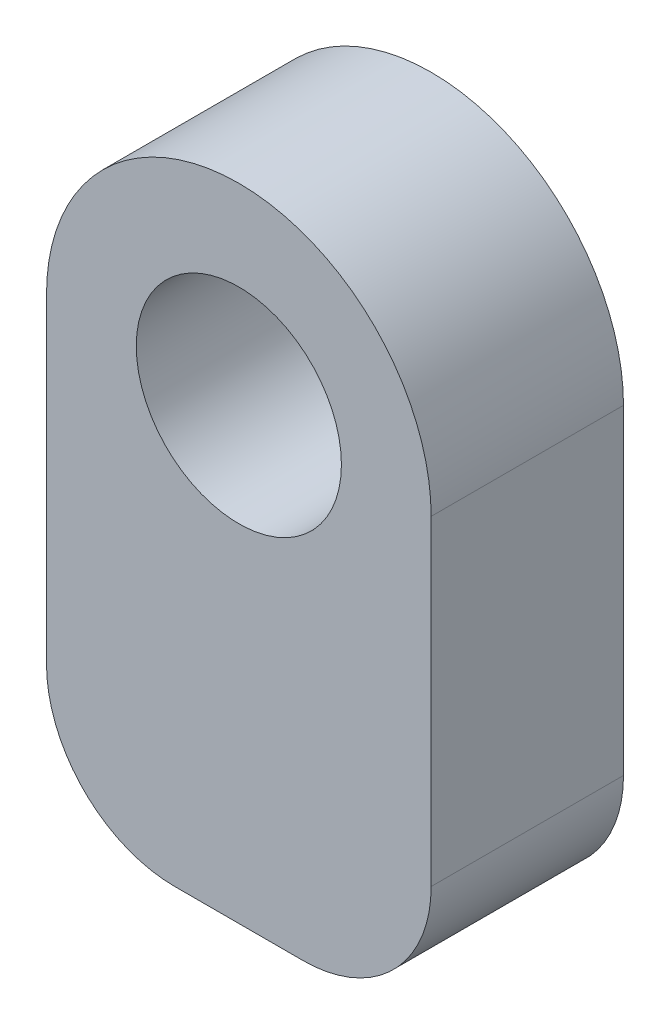
ISO-10303-21;
HEADER;
FILE_DESCRIPTION(('STEP AP214'),'2;1');
FILE_NAME('part.step','',(''),(''),'','','');
FILE_SCHEMA(('AUTOMOTIVE_DESIGN { 1 0 10303 214 1 1 1 1 }'));
ENDSEC;
DATA;
#1=APPLICATION_CONTEXT('core data for automotive mechanical design processes');
#2=APPLICATION_PROTOCOL_DEFINITION('international standard','automotive_design',2000,#1);
#3=PRODUCT_CONTEXT('',#1,'mechanical');
#4=PRODUCT('Part','Part','',(#3));
#5=PRODUCT_RELATED_PRODUCT_CATEGORY('part','',(#4));
#6=PRODUCT_DEFINITION_FORMATION('','',#4);
#7=PRODUCT_DEFINITION_CONTEXT('part definition',#1,'design');
#8=PRODUCT_DEFINITION('design','',#6,#7);
#9=PRODUCT_DEFINITION_SHAPE('','',#8);
#10=(LENGTH_UNIT() NAMED_UNIT(*) SI_UNIT(.MILLI.,.METRE.));
#11=(NAMED_UNIT(*) PLANE_ANGLE_UNIT() SI_UNIT($,.RADIAN.));
#12=(NAMED_UNIT(*) SI_UNIT($,.STERADIAN.) SOLID_ANGLE_UNIT());
#13=UNCERTAINTY_MEASURE_WITH_UNIT(LENGTH_MEASURE(1.E-05),#10,'distance_accuracy_value','');
#14=(GEOMETRIC_REPRESENTATION_CONTEXT(3) GLOBAL_UNCERTAINTY_ASSIGNED_CONTEXT((#13)) GLOBAL_UNIT_ASSIGNED_CONTEXT((#10,
#11,#12)) REPRESENTATION_CONTEXT('',''));
#15=CARTESIAN_POINT('',(0.,0.,0.));
#16=DIRECTION('',(0.,0.,1.));
#17=DIRECTION('',(1.,0.,0.));
#18=AXIS2_PLACEMENT_3D('',#15,#16,#17);
#19=CARTESIAN_POINT('',(0.,3.5,3.));
#20=DIRECTION('',(0.,0.,-1.));
#21=DIRECTION('',(-1.,0.,0.));
#22=AXIS2_PLACEMENT_3D('',#19,#20,#21);
#23=PLANE('',#22);
#24=DIRECTION('',(0.,-1.,0.));
#25=VECTOR('',#24,1.);
#26=CARTESIAN_POINT('',(-3.,-3.5,3.));
#27=LINE('',#26,#25);
#28=CARTESIAN_POINT('',(-3.,3.5,3.));
#29=VERTEX_POINT('',#28);
#30=CARTESIAN_POINT('',(-3.,-1.5,3.));
#31=VERTEX_POINT('',#30);
#32=EDGE_CURVE('E88',#29,#31,#27,.T.);
#33=ORIENTED_EDGE('',*,*,#32,.T.);
#34=CARTESIAN_POINT('',(-0.999999999999999,-1.5,3.));
#35=DIRECTION('',(0.,0.,-1.));
#36=DIRECTION('',(-1.,0.,0.));
#37=AXIS2_PLACEMENT_3D('',#34,#35,#36);
#38=CIRCLE('',#37,2.);
#39=CARTESIAN_POINT('',(-0.999999999999999,-3.5,3.));
#40=VERTEX_POINT('',#39);
#41=EDGE_CURVE('E43',#31,#40,#38,.F.);
#42=ORIENTED_EDGE('',*,*,#41,.T.);
#43=DIRECTION('',(1.,0.,0.));
#44=VECTOR('',#43,1.);
#45=CARTESIAN_POINT('',(3.,-3.5,3.));
#46=LINE('',#45,#44);
#47=CARTESIAN_POINT('',(1.,-3.5,3.));
#48=VERTEX_POINT('',#47);
#49=EDGE_CURVE('E95',#40,#48,#46,.T.);
#50=ORIENTED_EDGE('',*,*,#49,.T.);
#51=CARTESIAN_POINT('',(1.,-1.5,3.));
#52=DIRECTION('',(0.,0.,-1.));
#53=DIRECTION('',(-1.,0.,0.));
#54=AXIS2_PLACEMENT_3D('',#51,#52,#53);
#55=CIRCLE('',#54,2.);
#56=CARTESIAN_POINT('',(3.,-1.5,3.));
#57=VERTEX_POINT('',#56);
#58=EDGE_CURVE('E50',#48,#57,#55,.F.);
#59=ORIENTED_EDGE('',*,*,#58,.T.);
#60=DIRECTION('',(0.,1.,0.));
#61=VECTOR('',#60,1.);
#62=CARTESIAN_POINT('',(3.,-3.5,3.));
#63=LINE('',#62,#61);
#64=CARTESIAN_POINT('',(3.,3.5,3.));
#65=VERTEX_POINT('',#64);
#66=EDGE_CURVE('E100',#57,#65,#63,.T.);
#67=ORIENTED_EDGE('',*,*,#66,.T.);
#68=CARTESIAN_POINT('',(0.,3.5,3.));
#69=DIRECTION('',(0.,0.,1.));
#70=DIRECTION('',(-1.,0.,0.));
#71=AXIS2_PLACEMENT_3D('',#68,#69,#70);
#72=CIRCLE('',#71,3.);
#73=EDGE_CURVE('E96',#65,#29,#72,.T.);
#74=ORIENTED_EDGE('',*,*,#73,.T.);
#75=EDGE_LOOP('',(#33,#42,#50,#59,#67,#74));
#76=FACE_BOUND('',#75,.T.);
#77=CARTESIAN_POINT('',(0.,3.5,3.));
#78=DIRECTION('',(0.,0.,1.));
#79=DIRECTION('',(1.,0.,0.));
#80=AXIS2_PLACEMENT_3D('',#77,#78,#79);
#81=CIRCLE('',#80,1.6);
#82=CARTESIAN_POINT('',(1.6,3.5,3.));
#83=VERTEX_POINT('',#82);
#84=EDGE_CURVE('E141',#83,#83,#81,.T.);
#85=ORIENTED_EDGE('',*,*,#84,.F.);
#86=EDGE_LOOP('',(#85));
#87=FACE_BOUND('',#86,.T.);
#88=ADVANCED_FACE('F35',(#76,#87),#23,.F.);
#89=CARTESIAN_POINT('',(0.,3.5,0.));
#90=DIRECTION('',(0.,0.,-1.));
#91=DIRECTION('',(-1.,0.,0.));
#92=AXIS2_PLACEMENT_3D('',#89,#90,#91);
#93=PLANE('',#92);
#94=DIRECTION('',(1.,0.,0.));
#95=VECTOR('',#94,1.);
#96=CARTESIAN_POINT('',(3.,-3.5,0.));
#97=LINE('',#96,#95);
#98=CARTESIAN_POINT('',(-0.999999999999999,-3.5,0.));
#99=VERTEX_POINT('',#98);
#100=CARTESIAN_POINT('',(1.,-3.5,0.));
#101=VERTEX_POINT('',#100);
#102=EDGE_CURVE('E138',#99,#101,#97,.T.);
#103=ORIENTED_EDGE('',*,*,#102,.F.);
#104=CARTESIAN_POINT('',(-0.999999999999999,-1.5,0.));
#105=DIRECTION('',(0.,0.,-1.));
#106=DIRECTION('',(-1.,0.,0.));
#107=AXIS2_PLACEMENT_3D('',#104,#105,#106);
#108=CIRCLE('',#107,2.);
#109=CARTESIAN_POINT('',(-3.,-1.5,0.));
#110=VERTEX_POINT('',#109);
#111=EDGE_CURVE('E121',#99,#110,#108,.T.);
#112=ORIENTED_EDGE('',*,*,#111,.T.);
#113=DIRECTION('',(0.,-1.,0.));
#114=VECTOR('',#113,1.);
#115=CARTESIAN_POINT('',(-3.,-3.5,0.));
#116=LINE('',#115,#114);
#117=CARTESIAN_POINT('',(-3.,3.5,0.));
#118=VERTEX_POINT('',#117);
#119=EDGE_CURVE('E137',#118,#110,#116,.T.);
#120=ORIENTED_EDGE('',*,*,#119,.F.);
#121=CARTESIAN_POINT('',(0.,3.5,0.));
#122=DIRECTION('',(0.,0.,1.));
#123=DIRECTION('',(-1.,0.,0.));
#124=AXIS2_PLACEMENT_3D('',#121,#122,#123);
#125=CIRCLE('',#124,3.);
#126=CARTESIAN_POINT('',(3.,3.5,0.));
#127=VERTEX_POINT('',#126);
#128=EDGE_CURVE('E108',#127,#118,#125,.T.);
#129=ORIENTED_EDGE('',*,*,#128,.F.);
#130=DIRECTION('',(0.,1.,0.));
#131=VECTOR('',#130,1.);
#132=CARTESIAN_POINT('',(3.,-3.5,0.));
#133=LINE('',#132,#131);
#134=CARTESIAN_POINT('',(3.,-1.5,0.));
#135=VERTEX_POINT('',#134);
#136=EDGE_CURVE('E104',#135,#127,#133,.T.);
#137=ORIENTED_EDGE('',*,*,#136,.F.);
#138=CARTESIAN_POINT('',(1.,-1.5,0.));
#139=DIRECTION('',(0.,0.,-1.));
#140=DIRECTION('',(-1.,0.,0.));
#141=AXIS2_PLACEMENT_3D('',#138,#139,#140);
#142=CIRCLE('',#141,2.);
#143=EDGE_CURVE('E119',#135,#101,#142,.T.);
#144=ORIENTED_EDGE('',*,*,#143,.T.);
#145=EDGE_LOOP('',(#103,#112,#120,#129,#137,#144));
#146=FACE_BOUND('',#145,.T.);
#147=CARTESIAN_POINT('',(0.,3.5,0.));
#148=DIRECTION('',(0.,0.,1.));
#149=DIRECTION('',(1.,0.,0.));
#150=AXIS2_PLACEMENT_3D('',#147,#148,#149);
#151=CIRCLE('',#150,1.6);
#152=CARTESIAN_POINT('',(1.6,3.5,0.));
#153=VERTEX_POINT('',#152);
#154=EDGE_CURVE('E226',#153,#153,#151,.T.);
#155=ORIENTED_EDGE('',*,*,#154,.T.);
#156=EDGE_LOOP('',(#155));
#157=FACE_BOUND('',#156,.T.);
#158=ADVANCED_FACE('F135',(#146,#157),#93,.T.);
#159=CARTESIAN_POINT('',(0.,3.5,3.));
#160=DIRECTION('',(0.,0.,-1.));
#161=DIRECTION('',(-1.,0.,0.));
#162=AXIS2_PLACEMENT_3D('',#159,#160,#161);
#163=CYLINDRICAL_SURFACE('',#162,3.);
#164=ORIENTED_EDGE('',*,*,#128,.T.);
#165=DIRECTION('',(0.,0.,-1.));
#166=VECTOR('',#165,1.);
#167=CARTESIAN_POINT('',(-3.,3.5,3.));
#168=LINE('',#167,#166);
#169=EDGE_CURVE('E92',#29,#118,#168,.T.);
#170=ORIENTED_EDGE('',*,*,#169,.F.);
#171=ORIENTED_EDGE('',*,*,#73,.F.);
#172=DIRECTION('',(0.,0.,-1.));
#173=VECTOR('',#172,1.);
#174=CARTESIAN_POINT('',(3.,3.5,3.));
#175=LINE('',#174,#173);
#176=EDGE_CURVE('E110',#65,#127,#175,.T.);
#177=ORIENTED_EDGE('',*,*,#176,.T.);
#178=EDGE_LOOP('',(#164,#170,#171,#177));
#179=FACE_BOUND('',#178,.T.);
#180=ADVANCED_FACE('F106',(#179),#163,.T.);
#181=CARTESIAN_POINT('',(-3.,-3.5,3.));
#182=DIRECTION('',(1.,0.,0.));
#183=DIRECTION('',(0.,0.,-1.));
#184=AXIS2_PLACEMENT_3D('',#181,#182,#183);
#185=PLANE('',#184);
#186=ORIENTED_EDGE('',*,*,#119,.T.);
#187=DIRECTION('',(0.,0.,-1.));
#188=VECTOR('',#187,1.);
#189=CARTESIAN_POINT('',(-3.,-1.5,3.));
#190=LINE('',#189,#188);
#191=EDGE_CURVE('E58',#110,#31,#190,.F.);
#192=ORIENTED_EDGE('',*,*,#191,.T.);
#193=ORIENTED_EDGE('',*,*,#32,.F.);
#194=ORIENTED_EDGE('',*,*,#169,.T.);
#195=EDGE_LOOP('',(#186,#192,#193,#194));
#196=FACE_BOUND('',#195,.T.);
#197=ADVANCED_FACE('F90',(#196),#185,.F.);
#198=CARTESIAN_POINT('',(3.,-3.5,3.));
#199=DIRECTION('',(0.,1.,0.));
#200=DIRECTION('',(-1.,0.,0.));
#201=AXIS2_PLACEMENT_3D('',#198,#199,#200);
#202=PLANE('',#201);
#203=ORIENTED_EDGE('',*,*,#49,.F.);
#204=DIRECTION('',(0.,0.,-1.));
#205=VECTOR('',#204,1.);
#206=CARTESIAN_POINT('',(-0.999999999999999,-3.5,3.));
#207=LINE('',#206,#205);
#208=EDGE_CURVE('E112',#40,#99,#207,.T.);
#209=ORIENTED_EDGE('',*,*,#208,.T.);
#210=ORIENTED_EDGE('',*,*,#102,.T.);
#211=DIRECTION('',(0.,0.,-1.));
#212=VECTOR('',#211,1.);
#213=CARTESIAN_POINT('',(1.,-3.5,3.));
#214=LINE('',#213,#212);
#215=EDGE_CURVE('E109',#101,#48,#214,.F.);
#216=ORIENTED_EDGE('',*,*,#215,.T.);
#217=EDGE_LOOP('',(#203,#209,#210,#216));
#218=FACE_BOUND('',#217,.T.);
#219=ADVANCED_FACE('F128',(#218),#202,.F.);
#220=CARTESIAN_POINT('',(3.,-3.5,3.));
#221=DIRECTION('',(-1.,0.,0.));
#222=DIRECTION('',(0.,0.,1.));
#223=AXIS2_PLACEMENT_3D('',#220,#221,#222);
#224=PLANE('',#223);
#225=ORIENTED_EDGE('',*,*,#66,.F.);
#226=DIRECTION('',(0.,0.,-1.));
#227=VECTOR('',#226,1.);
#228=CARTESIAN_POINT('',(3.,-1.5,3.));
#229=LINE('',#228,#227);
#230=EDGE_CURVE('E11',#57,#135,#229,.T.);
#231=ORIENTED_EDGE('',*,*,#230,.T.);
#232=ORIENTED_EDGE('',*,*,#136,.T.);
#233=ORIENTED_EDGE('',*,*,#176,.F.);
#234=EDGE_LOOP('',(#225,#231,#232,#233));
#235=FACE_BOUND('',#234,.T.);
#236=ADVANCED_FACE('F146',(#235),#224,.F.);
#237=CARTESIAN_POINT('',(0.,3.5,3.));
#238=DIRECTION('',(0.,0.,-1.));
#239=DIRECTION('',(-1.,0.,0.));
#240=AXIS2_PLACEMENT_3D('',#237,#238,#239);
#241=CYLINDRICAL_SURFACE('',#240,1.6);
#242=ORIENTED_EDGE('',*,*,#84,.T.);
#243=EDGE_LOOP('',(#242));
#244=FACE_BOUND('',#243,.T.);
#245=ORIENTED_EDGE('',*,*,#154,.F.);
#246=EDGE_LOOP('',(#245));
#247=FACE_BOUND('',#246,.T.);
#248=ADVANCED_FACE('F153',(#244,#247),#241,.F.);
#249=CARTESIAN_POINT('',(-0.999999999999999,-1.5,3.));
#250=DIRECTION('',(0.,0.,-1.));
#251=DIRECTION('',(-1.,0.,0.));
#252=AXIS2_PLACEMENT_3D('',#249,#250,#251);
#253=CYLINDRICAL_SURFACE('',#252,2.);
#254=ORIENTED_EDGE('',*,*,#41,.F.);
#255=ORIENTED_EDGE('',*,*,#191,.F.);
#256=ORIENTED_EDGE('',*,*,#111,.F.);
#257=ORIENTED_EDGE('',*,*,#208,.F.);
#258=EDGE_LOOP('',(#254,#255,#256,#257));
#259=FACE_BOUND('',#258,.T.);
#260=ADVANCED_FACE('F133',(#259),#253,.T.);
#261=CARTESIAN_POINT('',(1.,-1.5,3.));
#262=DIRECTION('',(0.,0.,-1.));
#263=DIRECTION('',(-1.,0.,0.));
#264=AXIS2_PLACEMENT_3D('',#261,#262,#263);
#265=CYLINDRICAL_SURFACE('',#264,2.);
#266=ORIENTED_EDGE('',*,*,#58,.F.);
#267=ORIENTED_EDGE('',*,*,#215,.F.);
#268=ORIENTED_EDGE('',*,*,#143,.F.);
#269=ORIENTED_EDGE('',*,*,#230,.F.);
#270=EDGE_LOOP('',(#266,#267,#268,#269));
#271=FACE_BOUND('',#270,.T.);
#272=ADVANCED_FACE('F37',(#271),#265,.T.);
#273=CLOSED_SHELL('',(#88,#158,#180,#197,#219,#236,#248,#260,#272));
#274=MANIFOLD_SOLID_BREP('B2',#273);
#275=ADVANCED_BREP_SHAPE_REPRESENTATION('',(#18,#274),#14);
#276=SHAPE_DEFINITION_REPRESENTATION(#9,#275);
ENDSEC;
END-ISO-10303-21;
